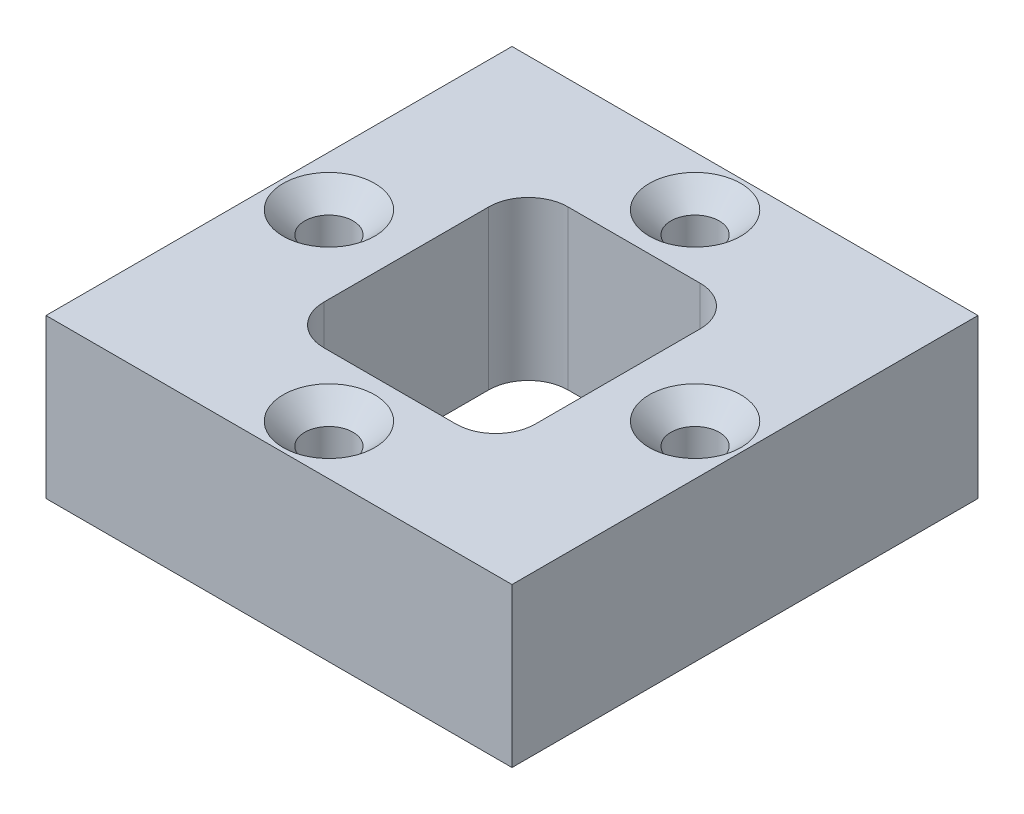
ISO-10303-21;
HEADER;
FILE_DESCRIPTION(('STEP AP214'),'2;1');
FILE_NAME('part.step','',(''),(''),'','','');
FILE_SCHEMA(('AUTOMOTIVE_DESIGN { 1 0 10303 214 1 1 1 1 }'));
ENDSEC;
DATA;
#1=APPLICATION_CONTEXT('core data for automotive mechanical design processes');
#2=APPLICATION_PROTOCOL_DEFINITION('international standard','automotive_design',2000,#1);
#3=PRODUCT_CONTEXT('',#1,'mechanical');
#4=PRODUCT('Part','Part','',(#3));
#5=PRODUCT_RELATED_PRODUCT_CATEGORY('part','',(#4));
#6=PRODUCT_DEFINITION_FORMATION('','',#4);
#7=PRODUCT_DEFINITION_CONTEXT('part definition',#1,'design');
#8=PRODUCT_DEFINITION('design','',#6,#7);
#9=PRODUCT_DEFINITION_SHAPE('','',#8);
#10=(LENGTH_UNIT() NAMED_UNIT(*) SI_UNIT(.MILLI.,.METRE.));
#11=(NAMED_UNIT(*) PLANE_ANGLE_UNIT() SI_UNIT($,.RADIAN.));
#12=(NAMED_UNIT(*) SI_UNIT($,.STERADIAN.) SOLID_ANGLE_UNIT());
#13=UNCERTAINTY_MEASURE_WITH_UNIT(LENGTH_MEASURE(1.E-05),#10,'distance_accuracy_value','');
#14=(GEOMETRIC_REPRESENTATION_CONTEXT(3) GLOBAL_UNCERTAINTY_ASSIGNED_CONTEXT((#13)) GLOBAL_UNIT_ASSIGNED_CONTEXT((#10,
#11,#12)) REPRESENTATION_CONTEXT('',''));
#15=CARTESIAN_POINT('',(0.,0.,0.));
#16=DIRECTION('',(0.,0.,1.));
#17=DIRECTION('',(1.,0.,0.));
#18=AXIS2_PLACEMENT_3D('',#15,#16,#17);
#19=CARTESIAN_POINT('',(-14.,9.525,14.));
#20=DIRECTION('',(1.,0.,0.));
#21=DIRECTION('',(0.,0.,-1.));
#22=AXIS2_PLACEMENT_3D('',#19,#20,#21);
#23=PLANE('',#22);
#24=DIRECTION('',(0.,0.,1.));
#25=VECTOR('',#24,1.);
#26=CARTESIAN_POINT('',(-14.,0.,14.));
#27=LINE('',#26,#25);
#28=CARTESIAN_POINT('',(-14.,0.,-14.));
#29=VERTEX_POINT('',#28);
#30=CARTESIAN_POINT('',(-14.,0.,14.));
#31=VERTEX_POINT('',#30);
#32=EDGE_CURVE('E153',#29,#31,#27,.T.);
#33=ORIENTED_EDGE('',*,*,#32,.T.);
#34=DIRECTION('',(0.,-1.,0.));
#35=VECTOR('',#34,1.);
#36=CARTESIAN_POINT('',(-14.,9.525,14.));
#37=LINE('',#36,#35);
#38=CARTESIAN_POINT('',(-14.,9.525,14.));
#39=VERTEX_POINT('',#38);
#40=EDGE_CURVE('E134',#39,#31,#37,.T.);
#41=ORIENTED_EDGE('',*,*,#40,.F.);
#42=DIRECTION('',(0.,0.,1.));
#43=VECTOR('',#42,1.);
#44=CARTESIAN_POINT('',(-14.,9.525,14.));
#45=LINE('',#44,#43);
#46=CARTESIAN_POINT('',(-14.,9.525,-14.));
#47=VERTEX_POINT('',#46);
#48=EDGE_CURVE('E141',#47,#39,#45,.T.);
#49=ORIENTED_EDGE('',*,*,#48,.F.);
#50=DIRECTION('',(0.,-1.,0.));
#51=VECTOR('',#50,1.);
#52=CARTESIAN_POINT('',(-14.,9.525,-14.));
#53=LINE('',#52,#51);
#54=EDGE_CURVE('E246',#47,#29,#53,.T.);
#55=ORIENTED_EDGE('',*,*,#54,.T.);
#56=EDGE_LOOP('',(#33,#41,#49,#55));
#57=FACE_BOUND('',#56,.T.);
#58=ADVANCED_FACE('F39',(#57),#23,.F.);
#59=CARTESIAN_POINT('',(14.,9.525,14.));
#60=DIRECTION('',(0.,0.,-1.));
#61=DIRECTION('',(-1.,0.,0.));
#62=AXIS2_PLACEMENT_3D('',#59,#60,#61);
#63=PLANE('',#62);
#64=DIRECTION('',(1.,0.,0.));
#65=VECTOR('',#64,1.);
#66=CARTESIAN_POINT('',(14.,0.,14.));
#67=LINE('',#66,#65);
#68=CARTESIAN_POINT('',(14.,0.,14.));
#69=VERTEX_POINT('',#68);
#70=EDGE_CURVE('E248',#31,#69,#67,.T.);
#71=ORIENTED_EDGE('',*,*,#70,.T.);
#72=DIRECTION('',(0.,-1.,0.));
#73=VECTOR('',#72,1.);
#74=CARTESIAN_POINT('',(14.,9.525,14.));
#75=LINE('',#74,#73);
#76=CARTESIAN_POINT('',(14.,9.525,14.));
#77=VERTEX_POINT('',#76);
#78=EDGE_CURVE('E137',#77,#69,#75,.T.);
#79=ORIENTED_EDGE('',*,*,#78,.F.);
#80=DIRECTION('',(1.,0.,0.));
#81=VECTOR('',#80,1.);
#82=CARTESIAN_POINT('',(14.,9.525,14.));
#83=LINE('',#82,#81);
#84=EDGE_CURVE('E130',#39,#77,#83,.T.);
#85=ORIENTED_EDGE('',*,*,#84,.F.);
#86=ORIENTED_EDGE('',*,*,#40,.T.);
#87=EDGE_LOOP('',(#71,#79,#85,#86));
#88=FACE_BOUND('',#87,.T.);
#89=ADVANCED_FACE('F132',(#88),#63,.F.);
#90=CARTESIAN_POINT('',(14.,9.525,14.));
#91=DIRECTION('',(-1.,0.,0.));
#92=DIRECTION('',(0.,0.,1.));
#93=AXIS2_PLACEMENT_3D('',#90,#91,#92);
#94=PLANE('',#93);
#95=DIRECTION('',(0.,0.,-1.));
#96=VECTOR('',#95,1.);
#97=CARTESIAN_POINT('',(14.,0.,14.));
#98=LINE('',#97,#96);
#99=CARTESIAN_POINT('',(14.,0.,-14.));
#100=VERTEX_POINT('',#99);
#101=EDGE_CURVE('E250',#69,#100,#98,.T.);
#102=ORIENTED_EDGE('',*,*,#101,.T.);
#103=DIRECTION('',(0.,-1.,0.));
#104=VECTOR('',#103,1.);
#105=CARTESIAN_POINT('',(14.,9.525,-14.));
#106=LINE('',#105,#104);
#107=CARTESIAN_POINT('',(14.,9.525,-14.));
#108=VERTEX_POINT('',#107);
#109=EDGE_CURVE('E158',#108,#100,#106,.T.);
#110=ORIENTED_EDGE('',*,*,#109,.F.);
#111=DIRECTION('',(0.,0.,-1.));
#112=VECTOR('',#111,1.);
#113=CARTESIAN_POINT('',(14.,9.525,14.));
#114=LINE('',#113,#112);
#115=EDGE_CURVE('E140',#77,#108,#114,.T.);
#116=ORIENTED_EDGE('',*,*,#115,.F.);
#117=ORIENTED_EDGE('',*,*,#78,.T.);
#118=EDGE_LOOP('',(#102,#110,#116,#117));
#119=FACE_BOUND('',#118,.T.);
#120=ADVANCED_FACE('F262',(#119),#94,.F.);
#121=CARTESIAN_POINT('',(14.,9.525,-14.));
#122=DIRECTION('',(0.,0.,1.));
#123=DIRECTION('',(1.,0.,0.));
#124=AXIS2_PLACEMENT_3D('',#121,#122,#123);
#125=PLANE('',#124);
#126=DIRECTION('',(-1.,0.,0.));
#127=VECTOR('',#126,1.);
#128=CARTESIAN_POINT('',(14.,0.,-14.));
#129=LINE('',#128,#127);
#130=EDGE_CURVE('E150',#100,#29,#129,.T.);
#131=ORIENTED_EDGE('',*,*,#130,.T.);
#132=ORIENTED_EDGE('',*,*,#54,.F.);
#133=DIRECTION('',(-1.,0.,0.));
#134=VECTOR('',#133,1.);
#135=CARTESIAN_POINT('',(14.,9.525,-14.));
#136=LINE('',#135,#134);
#137=EDGE_CURVE('E146',#108,#47,#136,.T.);
#138=ORIENTED_EDGE('',*,*,#137,.F.);
#139=ORIENTED_EDGE('',*,*,#109,.T.);
#140=EDGE_LOOP('',(#131,#132,#138,#139));
#141=FACE_BOUND('',#140,.T.);
#142=ADVANCED_FACE('F257',(#141),#125,.F.);
#143=CARTESIAN_POINT('',(0.,9.525,0.));
#144=DIRECTION('',(0.,1.,0.));
#145=DIRECTION('',(0.,0.,1.));
#146=AXIS2_PLACEMENT_3D('',#143,#144,#145);
#147=PLANE('',#146);
#148=CARTESIAN_POINT('',(-11.,9.525,0.));
#149=DIRECTION('',(0.,1.,0.));
#150=DIRECTION('',(0.,0.,1.));
#151=AXIS2_PLACEMENT_3D('',#148,#149,#150);
#152=CIRCLE('',#151,2.75);
#153=CARTESIAN_POINT('',(-11.,9.525,2.75));
#154=VERTEX_POINT('',#153);
#155=EDGE_CURVE('E370',#154,#154,#152,.T.);
#156=ORIENTED_EDGE('',*,*,#155,.F.);
#157=EDGE_LOOP('',(#156));
#158=FACE_BOUND('',#157,.T.);
#159=CARTESIAN_POINT('',(0.,9.525,11.));
#160=DIRECTION('',(0.,1.,0.));
#161=DIRECTION('',(0.,0.,1.));
#162=AXIS2_PLACEMENT_3D('',#159,#160,#161);
#163=CIRCLE('',#162,2.75);
#164=CARTESIAN_POINT('',(0.,9.525,13.75));
#165=VERTEX_POINT('',#164);
#166=EDGE_CURVE('E208',#165,#165,#163,.T.);
#167=ORIENTED_EDGE('',*,*,#166,.F.);
#168=EDGE_LOOP('',(#167));
#169=FACE_BOUND('',#168,.T.);
#170=CARTESIAN_POINT('',(11.,9.525,0.));
#171=DIRECTION('',(0.,1.,0.));
#172=DIRECTION('',(0.,0.,1.));
#173=AXIS2_PLACEMENT_3D('',#170,#171,#172);
#174=CIRCLE('',#173,2.75);
#175=CARTESIAN_POINT('',(11.,9.525,2.75));
#176=VERTEX_POINT('',#175);
#177=EDGE_CURVE('E201',#176,#176,#174,.T.);
#178=ORIENTED_EDGE('',*,*,#177,.F.);
#179=EDGE_LOOP('',(#178));
#180=FACE_BOUND('',#179,.T.);
#181=CARTESIAN_POINT('',(0.,9.525,-11.));
#182=DIRECTION('',(0.,1.,0.));
#183=DIRECTION('',(0.,0.,1.));
#184=AXIS2_PLACEMENT_3D('',#181,#182,#183);
#185=CIRCLE('',#184,2.75);
#186=CARTESIAN_POINT('',(0.,9.525,-8.25));
#187=VERTEX_POINT('',#186);
#188=EDGE_CURVE('E197',#187,#187,#185,.T.);
#189=ORIENTED_EDGE('',*,*,#188,.F.);
#190=EDGE_LOOP('',(#189));
#191=FACE_BOUND('',#190,.T.);
#192=DIRECTION('',(0.,0.,1.));
#193=VECTOR('',#192,1.);
#194=CARTESIAN_POINT('',(-6.35,9.525,7.332345));
#195=LINE('',#194,#193);
#196=CARTESIAN_POINT('',(-6.35,9.525,-4.951095));
#197=VERTEX_POINT('',#196);
#198=CARTESIAN_POINT('',(-6.35,9.525,4.951095));
#199=VERTEX_POINT('',#198);
#200=EDGE_CURVE('E193',#197,#199,#195,.T.);
#201=ORIENTED_EDGE('',*,*,#200,.F.);
#202=CARTESIAN_POINT('',(-3.96875,9.525,-4.951095));
#203=DIRECTION('',(0.,1.,0.));
#204=DIRECTION('',(0.,0.,1.));
#205=AXIS2_PLACEMENT_3D('',#202,#203,#204);
#206=CIRCLE('',#205,2.38125);
#207=CARTESIAN_POINT('',(-3.96875,9.525,-7.332345));
#208=VERTEX_POINT('',#207);
#209=EDGE_CURVE('E178',#197,#208,#206,.F.);
#210=ORIENTED_EDGE('',*,*,#209,.T.);
#211=DIRECTION('',(-1.,0.,0.));
#212=VECTOR('',#211,1.);
#213=CARTESIAN_POINT('',(6.35,9.525,-7.332345));
#214=LINE('',#213,#212);
#215=CARTESIAN_POINT('',(3.96875,9.525,-7.332345));
#216=VERTEX_POINT('',#215);
#217=EDGE_CURVE('E226',#216,#208,#214,.T.);
#218=ORIENTED_EDGE('',*,*,#217,.F.);
#219=CARTESIAN_POINT('',(3.96875,9.525,-4.951095));
#220=DIRECTION('',(0.,1.,0.));
#221=DIRECTION('',(0.,0.,1.));
#222=AXIS2_PLACEMENT_3D('',#219,#220,#221);
#223=CIRCLE('',#222,2.38125);
#224=CARTESIAN_POINT('',(6.35,9.525,-4.951095));
#225=VERTEX_POINT('',#224);
#226=EDGE_CURVE('E182',#216,#225,#223,.F.);
#227=ORIENTED_EDGE('',*,*,#226,.T.);
#228=DIRECTION('',(0.,0.,-1.));
#229=VECTOR('',#228,1.);
#230=CARTESIAN_POINT('',(6.35,9.525,7.332345));
#231=LINE('',#230,#229);
#232=CARTESIAN_POINT('',(6.35,9.525,4.951095));
#233=VERTEX_POINT('',#232);
#234=EDGE_CURVE('E237',#233,#225,#231,.T.);
#235=ORIENTED_EDGE('',*,*,#234,.F.);
#236=CARTESIAN_POINT('',(3.96875,9.525,4.951095));
#237=DIRECTION('',(0.,1.,0.));
#238=DIRECTION('',(0.,0.,1.));
#239=AXIS2_PLACEMENT_3D('',#236,#237,#238);
#240=CIRCLE('',#239,2.38125);
#241=CARTESIAN_POINT('',(3.96875,9.525,7.332345));
#242=VERTEX_POINT('',#241);
#243=EDGE_CURVE('E56',#233,#242,#240,.F.);
#244=ORIENTED_EDGE('',*,*,#243,.T.);
#245=DIRECTION('',(1.,0.,0.));
#246=VECTOR('',#245,1.);
#247=CARTESIAN_POINT('',(6.35,9.525,7.332345));
#248=LINE('',#247,#246);
#249=CARTESIAN_POINT('',(-3.96875,9.525,7.332345));
#250=VERTEX_POINT('',#249);
#251=EDGE_CURVE('E235',#250,#242,#248,.T.);
#252=ORIENTED_EDGE('',*,*,#251,.F.);
#253=CARTESIAN_POINT('',(-3.96875,9.525,4.951095));
#254=DIRECTION('',(0.,1.,0.));
#255=DIRECTION('',(0.,0.,1.));
#256=AXIS2_PLACEMENT_3D('',#253,#254,#255);
#257=CIRCLE('',#256,2.38125);
#258=EDGE_CURVE('E48',#250,#199,#257,.F.);
#259=ORIENTED_EDGE('',*,*,#258,.T.);
#260=EDGE_LOOP('',(#201,#210,#218,#227,#235,#244,#252,#259));
#261=FACE_BOUND('',#260,.T.);
#262=ORIENTED_EDGE('',*,*,#48,.T.);
#263=ORIENTED_EDGE('',*,*,#84,.T.);
#264=ORIENTED_EDGE('',*,*,#115,.T.);
#265=ORIENTED_EDGE('',*,*,#137,.T.);
#266=EDGE_LOOP('',(#262,#263,#264,#265));
#267=FACE_BOUND('',#266,.T.);
#268=ADVANCED_FACE('F144',(#158,#169,#180,#191,#261,#267),#147,.T.);
#269=CARTESIAN_POINT('',(0.,0.,0.));
#270=DIRECTION('',(0.,1.,0.));
#271=DIRECTION('',(0.,0.,1.));
#272=AXIS2_PLACEMENT_3D('',#269,#270,#271);
#273=PLANE('',#272);
#274=CARTESIAN_POINT('',(-11.,0.,0.));
#275=DIRECTION('',(0.,1.,0.));
#276=DIRECTION('',(0.,0.,1.));
#277=AXIS2_PLACEMENT_3D('',#274,#275,#276);
#278=CIRCLE('',#277,1.44999999999999);
#279=CARTESIAN_POINT('',(-11.,0.,1.44999999999999));
#280=VERTEX_POINT('',#279);
#281=EDGE_CURVE('E43',#280,#280,#278,.T.);
#282=ORIENTED_EDGE('',*,*,#281,.T.);
#283=EDGE_LOOP('',(#282));
#284=FACE_BOUND('',#283,.T.);
#285=CARTESIAN_POINT('',(0.,0.,11.));
#286=DIRECTION('',(0.,1.,0.));
#287=DIRECTION('',(0.,0.,1.));
#288=AXIS2_PLACEMENT_3D('',#285,#286,#287);
#289=CIRCLE('',#288,1.44999999999999);
#290=CARTESIAN_POINT('',(0.,0.,12.45));
#291=VERTEX_POINT('',#290);
#292=EDGE_CURVE('E199',#291,#291,#289,.T.);
#293=ORIENTED_EDGE('',*,*,#292,.T.);
#294=EDGE_LOOP('',(#293));
#295=FACE_BOUND('',#294,.T.);
#296=CARTESIAN_POINT('',(11.,0.,0.));
#297=DIRECTION('',(0.,1.,0.));
#298=DIRECTION('',(0.,0.,1.));
#299=AXIS2_PLACEMENT_3D('',#296,#297,#298);
#300=CIRCLE('',#299,1.44999999999999);
#301=CARTESIAN_POINT('',(11.,0.,1.44999999999999));
#302=VERTEX_POINT('',#301);
#303=EDGE_CURVE('E195',#302,#302,#300,.T.);
#304=ORIENTED_EDGE('',*,*,#303,.T.);
#305=EDGE_LOOP('',(#304));
#306=FACE_BOUND('',#305,.T.);
#307=CARTESIAN_POINT('',(0.,0.,-11.));
#308=DIRECTION('',(0.,1.,0.));
#309=DIRECTION('',(0.,0.,1.));
#310=AXIS2_PLACEMENT_3D('',#307,#308,#309);
#311=CIRCLE('',#310,1.44999999999999);
#312=CARTESIAN_POINT('',(0.,0.,-9.55000000000001));
#313=VERTEX_POINT('',#312);
#314=EDGE_CURVE('E190',#313,#313,#311,.T.);
#315=ORIENTED_EDGE('',*,*,#314,.T.);
#316=EDGE_LOOP('',(#315));
#317=FACE_BOUND('',#316,.T.);
#318=DIRECTION('',(1.,0.,0.));
#319=VECTOR('',#318,1.);
#320=CARTESIAN_POINT('',(6.35,0.,-7.332345));
#321=LINE('',#320,#319);
#322=CARTESIAN_POINT('',(-3.96875,0.,-7.332345));
#323=VERTEX_POINT('',#322);
#324=CARTESIAN_POINT('',(3.96875,0.,-7.332345));
#325=VERTEX_POINT('',#324);
#326=EDGE_CURVE('E225',#323,#325,#321,.T.);
#327=ORIENTED_EDGE('',*,*,#326,.F.);
#328=CARTESIAN_POINT('',(-3.96875,0.,-4.951095));
#329=DIRECTION('',(0.,1.,0.));
#330=DIRECTION('',(0.,0.,1.));
#331=AXIS2_PLACEMENT_3D('',#328,#329,#330);
#332=CIRCLE('',#331,2.38125);
#333=CARTESIAN_POINT('',(-6.35,0.,-4.951095));
#334=VERTEX_POINT('',#333);
#335=EDGE_CURVE('E180',#323,#334,#332,.T.);
#336=ORIENTED_EDGE('',*,*,#335,.T.);
#337=DIRECTION('',(0.,0.,-1.));
#338=VECTOR('',#337,1.);
#339=CARTESIAN_POINT('',(-6.35,0.,7.332345));
#340=LINE('',#339,#338);
#341=CARTESIAN_POINT('',(-6.35,0.,4.951095));
#342=VERTEX_POINT('',#341);
#343=EDGE_CURVE('E229',#342,#334,#340,.T.);
#344=ORIENTED_EDGE('',*,*,#343,.F.);
#345=CARTESIAN_POINT('',(-3.96875,0.,4.951095));
#346=DIRECTION('',(0.,1.,0.));
#347=DIRECTION('',(0.,0.,1.));
#348=AXIS2_PLACEMENT_3D('',#345,#346,#347);
#349=CIRCLE('',#348,2.38125);
#350=CARTESIAN_POINT('',(-3.96875,0.,7.332345));
#351=VERTEX_POINT('',#350);
#352=EDGE_CURVE('E11',#342,#351,#349,.T.);
#353=ORIENTED_EDGE('',*,*,#352,.T.);
#354=DIRECTION('',(-1.,0.,0.));
#355=VECTOR('',#354,1.);
#356=CARTESIAN_POINT('',(6.35,0.,7.332345));
#357=LINE('',#356,#355);
#358=CARTESIAN_POINT('',(3.96875,0.,7.332345));
#359=VERTEX_POINT('',#358);
#360=EDGE_CURVE('E232',#359,#351,#357,.T.);
#361=ORIENTED_EDGE('',*,*,#360,.F.);
#362=CARTESIAN_POINT('',(3.96875,0.,4.951095));
#363=DIRECTION('',(0.,1.,0.));
#364=DIRECTION('',(0.,0.,1.));
#365=AXIS2_PLACEMENT_3D('',#362,#363,#364);
#366=CIRCLE('',#365,2.38125);
#367=CARTESIAN_POINT('',(6.35,0.,4.951095));
#368=VERTEX_POINT('',#367);
#369=EDGE_CURVE('E187',#359,#368,#366,.T.);
#370=ORIENTED_EDGE('',*,*,#369,.T.);
#371=DIRECTION('',(0.,0.,1.));
#372=VECTOR('',#371,1.);
#373=CARTESIAN_POINT('',(6.35,0.,7.332345));
#374=LINE('',#373,#372);
#375=CARTESIAN_POINT('',(6.35,0.,-4.951095));
#376=VERTEX_POINT('',#375);
#377=EDGE_CURVE('E222',#376,#368,#374,.T.);
#378=ORIENTED_EDGE('',*,*,#377,.F.);
#379=CARTESIAN_POINT('',(3.96875,0.,-4.951095));
#380=DIRECTION('',(0.,1.,0.));
#381=DIRECTION('',(0.,0.,1.));
#382=AXIS2_PLACEMENT_3D('',#379,#380,#381);
#383=CIRCLE('',#382,2.38125);
#384=EDGE_CURVE('E184',#376,#325,#383,.T.);
#385=ORIENTED_EDGE('',*,*,#384,.T.);
#386=EDGE_LOOP('',(#327,#336,#344,#353,#361,#370,#378,#385));
#387=FACE_BOUND('',#386,.T.);
#388=ORIENTED_EDGE('',*,*,#32,.F.);
#389=ORIENTED_EDGE('',*,*,#130,.F.);
#390=ORIENTED_EDGE('',*,*,#101,.F.);
#391=ORIENTED_EDGE('',*,*,#70,.F.);
#392=EDGE_LOOP('',(#388,#389,#390,#391));
#393=FACE_BOUND('',#392,.T.);
#394=ADVANCED_FACE('F261',(#284,#295,#306,#317,#387,#393),#273,.F.);
#395=CARTESIAN_POINT('',(-6.35,-19.3995652733792,7.332345));
#396=DIRECTION('',(-1.,0.,0.));
#397=DIRECTION('',(0.,0.,1.));
#398=AXIS2_PLACEMENT_3D('',#395,#396,#397);
#399=PLANE('',#398);
#400=ORIENTED_EDGE('',*,*,#343,.T.);
#401=DIRECTION('',(0.,1.,0.));
#402=VECTOR('',#401,1.);
#403=CARTESIAN_POINT('',(-6.35,9.525,-4.951095));
#404=LINE('',#403,#402);
#405=EDGE_CURVE('E156',#334,#197,#404,.T.);
#406=ORIENTED_EDGE('',*,*,#405,.T.);
#407=ORIENTED_EDGE('',*,*,#200,.T.);
#408=DIRECTION('',(0.,1.,0.));
#409=VECTOR('',#408,1.);
#410=CARTESIAN_POINT('',(-6.35,0.,4.951095));
#411=LINE('',#410,#409);
#412=EDGE_CURVE('E154',#199,#342,#411,.F.);
#413=ORIENTED_EDGE('',*,*,#412,.T.);
#414=EDGE_LOOP('',(#400,#406,#407,#413));
#415=FACE_BOUND('',#414,.T.);
#416=ADVANCED_FACE('F312',(#415),#399,.F.);
#417=CARTESIAN_POINT('',(6.35,-19.3995652733792,-7.332345));
#418=DIRECTION('',(0.,0.,-1.));
#419=DIRECTION('',(-1.,0.,0.));
#420=AXIS2_PLACEMENT_3D('',#417,#418,#419);
#421=PLANE('',#420);
#422=ORIENTED_EDGE('',*,*,#217,.T.);
#423=DIRECTION('',(0.,1.,0.));
#424=VECTOR('',#423,1.);
#425=CARTESIAN_POINT('',(-3.96875,0.,-7.332345));
#426=LINE('',#425,#424);
#427=EDGE_CURVE('E167',#208,#323,#426,.F.);
#428=ORIENTED_EDGE('',*,*,#427,.T.);
#429=ORIENTED_EDGE('',*,*,#326,.T.);
#430=DIRECTION('',(0.,1.,0.));
#431=VECTOR('',#430,1.);
#432=CARTESIAN_POINT('',(3.96875,9.525,-7.332345));
#433=LINE('',#432,#431);
#434=EDGE_CURVE('E164',#325,#216,#433,.T.);
#435=ORIENTED_EDGE('',*,*,#434,.T.);
#436=EDGE_LOOP('',(#422,#428,#429,#435));
#437=FACE_BOUND('',#436,.T.);
#438=ADVANCED_FACE('F305',(#437),#421,.F.);
#439=CARTESIAN_POINT('',(6.35,-19.3995652733792,7.332345));
#440=DIRECTION('',(1.,0.,0.));
#441=DIRECTION('',(0.,0.,-1.));
#442=AXIS2_PLACEMENT_3D('',#439,#440,#441);
#443=PLANE('',#442);
#444=ORIENTED_EDGE('',*,*,#234,.T.);
#445=DIRECTION('',(0.,1.,0.));
#446=VECTOR('',#445,1.);
#447=CARTESIAN_POINT('',(6.35,0.,-4.951095));
#448=LINE('',#447,#446);
#449=EDGE_CURVE('E172',#225,#376,#448,.F.);
#450=ORIENTED_EDGE('',*,*,#449,.T.);
#451=ORIENTED_EDGE('',*,*,#377,.T.);
#452=DIRECTION('',(0.,1.,0.));
#453=VECTOR('',#452,1.);
#454=CARTESIAN_POINT('',(6.35,9.525,4.951095));
#455=LINE('',#454,#453);
#456=EDGE_CURVE('E169',#368,#233,#455,.T.);
#457=ORIENTED_EDGE('',*,*,#456,.T.);
#458=EDGE_LOOP('',(#444,#450,#451,#457));
#459=FACE_BOUND('',#458,.T.);
#460=ADVANCED_FACE('F300',(#459),#443,.F.);
#461=CARTESIAN_POINT('',(6.35,-19.3995652733792,7.332345));
#462=DIRECTION('',(0.,0.,1.));
#463=DIRECTION('',(1.,0.,0.));
#464=AXIS2_PLACEMENT_3D('',#461,#462,#463);
#465=PLANE('',#464);
#466=ORIENTED_EDGE('',*,*,#251,.T.);
#467=DIRECTION('',(0.,1.,0.));
#468=VECTOR('',#467,1.);
#469=CARTESIAN_POINT('',(3.96875,0.,7.332345));
#470=LINE('',#469,#468);
#471=EDGE_CURVE('E176',#242,#359,#470,.F.);
#472=ORIENTED_EDGE('',*,*,#471,.T.);
#473=ORIENTED_EDGE('',*,*,#360,.T.);
#474=DIRECTION('',(0.,1.,0.));
#475=VECTOR('',#474,1.);
#476=CARTESIAN_POINT('',(-3.96875,9.525,7.332345));
#477=LINE('',#476,#475);
#478=EDGE_CURVE('E174',#351,#250,#477,.T.);
#479=ORIENTED_EDGE('',*,*,#478,.T.);
#480=EDGE_LOOP('',(#466,#472,#473,#479));
#481=FACE_BOUND('',#480,.T.);
#482=ADVANCED_FACE('F280',(#481),#465,.F.);
#483=CARTESIAN_POINT('',(-3.96875,-19.3995652733792,-4.951095));
#484=DIRECTION('',(0.,-1.,0.));
#485=DIRECTION('',(0.,0.,-1.));
#486=AXIS2_PLACEMENT_3D('',#483,#484,#485);
#487=CYLINDRICAL_SURFACE('',#486,2.38125);
#488=ORIENTED_EDGE('',*,*,#335,.F.);
#489=ORIENTED_EDGE('',*,*,#427,.F.);
#490=ORIENTED_EDGE('',*,*,#209,.F.);
#491=ORIENTED_EDGE('',*,*,#405,.F.);
#492=EDGE_LOOP('',(#488,#489,#490,#491));
#493=FACE_BOUND('',#492,.T.);
#494=ADVANCED_FACE('F276',(#493),#487,.F.);
#495=CARTESIAN_POINT('',(3.96875,-19.3995652733792,-4.951095));
#496=DIRECTION('',(0.,-1.,0.));
#497=DIRECTION('',(0.,0.,-1.));
#498=AXIS2_PLACEMENT_3D('',#495,#496,#497);
#499=CYLINDRICAL_SURFACE('',#498,2.38125);
#500=ORIENTED_EDGE('',*,*,#384,.F.);
#501=ORIENTED_EDGE('',*,*,#449,.F.);
#502=ORIENTED_EDGE('',*,*,#226,.F.);
#503=ORIENTED_EDGE('',*,*,#434,.F.);
#504=EDGE_LOOP('',(#500,#501,#502,#503));
#505=FACE_BOUND('',#504,.T.);
#506=ADVANCED_FACE('F279',(#505),#499,.F.);
#507=CARTESIAN_POINT('',(3.96875,-19.3995652733792,4.951095));
#508=DIRECTION('',(0.,-1.,0.));
#509=DIRECTION('',(0.,0.,-1.));
#510=AXIS2_PLACEMENT_3D('',#507,#508,#509);
#511=CYLINDRICAL_SURFACE('',#510,2.38125);
#512=ORIENTED_EDGE('',*,*,#369,.F.);
#513=ORIENTED_EDGE('',*,*,#471,.F.);
#514=ORIENTED_EDGE('',*,*,#243,.F.);
#515=ORIENTED_EDGE('',*,*,#456,.F.);
#516=EDGE_LOOP('',(#512,#513,#514,#515));
#517=FACE_BOUND('',#516,.T.);
#518=ADVANCED_FACE('F283',(#517),#511,.F.);
#519=CARTESIAN_POINT('',(-3.96875,-19.3995652733792,4.951095));
#520=DIRECTION('',(0.,-1.,0.));
#521=DIRECTION('',(0.,0.,-1.));
#522=AXIS2_PLACEMENT_3D('',#519,#520,#521);
#523=CYLINDRICAL_SURFACE('',#522,2.38125);
#524=ORIENTED_EDGE('',*,*,#352,.F.);
#525=ORIENTED_EDGE('',*,*,#412,.F.);
#526=ORIENTED_EDGE('',*,*,#258,.F.);
#527=ORIENTED_EDGE('',*,*,#478,.F.);
#528=EDGE_LOOP('',(#524,#525,#526,#527));
#529=FACE_BOUND('',#528,.T.);
#530=ADVANCED_FACE('F41',(#529),#523,.F.);
#531=CARTESIAN_POINT('',(0.,9.525,-11.));
#532=DIRECTION('',(0.,1.,0.));
#533=DIRECTION('',(0.,0.,1.));
#534=AXIS2_PLACEMENT_3D('',#531,#532,#533);
#535=CYLINDRICAL_SURFACE('',#534,1.44999999999999);
#536=CARTESIAN_POINT('',(0.,8.225,-11.));
#537=DIRECTION('',(0.,1.,0.));
#538=DIRECTION('',(0.,0.,1.));
#539=AXIS2_PLACEMENT_3D('',#536,#537,#538);
#540=CIRCLE('',#539,1.45);
#541=CARTESIAN_POINT('',(0.,8.225,-9.55));
#542=VERTEX_POINT('',#541);
#543=EDGE_CURVE('E194',#542,#542,#540,.T.);
#544=ORIENTED_EDGE('',*,*,#543,.T.);
#545=EDGE_LOOP('',(#544));
#546=FACE_BOUND('',#545,.T.);
#547=ORIENTED_EDGE('',*,*,#314,.F.);
#548=EDGE_LOOP('',(#547));
#549=FACE_BOUND('',#548,.T.);
#550=ADVANCED_FACE('F290',(#546,#549),#535,.F.);
#551=CARTESIAN_POINT('',(0.,9.525,-11.));
#552=DIRECTION('',(0.,1.,0.));
#553=DIRECTION('',(0.,0.,1.));
#554=AXIS2_PLACEMENT_3D('',#551,#552,#553);
#555=CONICAL_SURFACE('',#554,2.75,0.785398163397448);
#556=ORIENTED_EDGE('',*,*,#543,.F.);
#557=EDGE_LOOP('',(#556));
#558=FACE_BOUND('',#557,.T.);
#559=ORIENTED_EDGE('',*,*,#188,.T.);
#560=EDGE_LOOP('',(#559));
#561=FACE_BOUND('',#560,.T.);
#562=ADVANCED_FACE('F336',(#558,#561),#555,.F.);
#563=CARTESIAN_POINT('',(11.,9.525,0.));
#564=DIRECTION('',(0.,1.,0.));
#565=DIRECTION('',(0.,0.,1.));
#566=AXIS2_PLACEMENT_3D('',#563,#564,#565);
#567=CYLINDRICAL_SURFACE('',#566,1.44999999999999);
#568=CARTESIAN_POINT('',(11.,8.225,0.));
#569=DIRECTION('',(0.,1.,0.));
#570=DIRECTION('',(0.,0.,1.));
#571=AXIS2_PLACEMENT_3D('',#568,#569,#570);
#572=CIRCLE('',#571,1.45);
#573=CARTESIAN_POINT('',(11.,8.225,1.45));
#574=VERTEX_POINT('',#573);
#575=EDGE_CURVE('E198',#574,#574,#572,.T.);
#576=ORIENTED_EDGE('',*,*,#575,.T.);
#577=EDGE_LOOP('',(#576));
#578=FACE_BOUND('',#577,.T.);
#579=ORIENTED_EDGE('',*,*,#303,.F.);
#580=EDGE_LOOP('',(#579));
#581=FACE_BOUND('',#580,.T.);
#582=ADVANCED_FACE('F340',(#578,#581),#567,.F.);
#583=CARTESIAN_POINT('',(11.,9.525,0.));
#584=DIRECTION('',(0.,1.,0.));
#585=DIRECTION('',(0.,0.,1.));
#586=AXIS2_PLACEMENT_3D('',#583,#584,#585);
#587=CONICAL_SURFACE('',#586,2.75,0.785398163397448);
#588=ORIENTED_EDGE('',*,*,#575,.F.);
#589=EDGE_LOOP('',(#588));
#590=FACE_BOUND('',#589,.T.);
#591=ORIENTED_EDGE('',*,*,#177,.T.);
#592=EDGE_LOOP('',(#591));
#593=FACE_BOUND('',#592,.T.);
#594=ADVANCED_FACE('F344',(#590,#593),#587,.F.);
#595=CARTESIAN_POINT('',(0.,9.525,11.));
#596=DIRECTION('',(0.,1.,0.));
#597=DIRECTION('',(0.,0.,1.));
#598=AXIS2_PLACEMENT_3D('',#595,#596,#597);
#599=CYLINDRICAL_SURFACE('',#598,1.44999999999999);
#600=CARTESIAN_POINT('',(0.,8.225,11.));
#601=DIRECTION('',(0.,1.,0.));
#602=DIRECTION('',(0.,0.,1.));
#603=AXIS2_PLACEMENT_3D('',#600,#601,#602);
#604=CIRCLE('',#603,1.45);
#605=CARTESIAN_POINT('',(0.,8.225,12.45));
#606=VERTEX_POINT('',#605);
#607=EDGE_CURVE('E202',#606,#606,#604,.T.);
#608=ORIENTED_EDGE('',*,*,#607,.T.);
#609=EDGE_LOOP('',(#608));
#610=FACE_BOUND('',#609,.T.);
#611=ORIENTED_EDGE('',*,*,#292,.F.);
#612=EDGE_LOOP('',(#611));
#613=FACE_BOUND('',#612,.T.);
#614=ADVANCED_FACE('F348',(#610,#613),#599,.F.);
#615=CARTESIAN_POINT('',(0.,9.525,11.));
#616=DIRECTION('',(0.,1.,0.));
#617=DIRECTION('',(0.,0.,1.));
#618=AXIS2_PLACEMENT_3D('',#615,#616,#617);
#619=CONICAL_SURFACE('',#618,2.75,0.785398163397448);
#620=ORIENTED_EDGE('',*,*,#607,.F.);
#621=EDGE_LOOP('',(#620));
#622=FACE_BOUND('',#621,.T.);
#623=ORIENTED_EDGE('',*,*,#166,.T.);
#624=EDGE_LOOP('',(#623));
#625=FACE_BOUND('',#624,.T.);
#626=ADVANCED_FACE('F352',(#622,#625),#619,.F.);
#627=CARTESIAN_POINT('',(-11.,9.525,0.));
#628=DIRECTION('',(0.,1.,0.));
#629=DIRECTION('',(0.,0.,1.));
#630=AXIS2_PLACEMENT_3D('',#627,#628,#629);
#631=CYLINDRICAL_SURFACE('',#630,1.44999999999999);
#632=CARTESIAN_POINT('',(-11.,8.225,0.));
#633=DIRECTION('',(0.,1.,0.));
#634=DIRECTION('',(0.,0.,1.));
#635=AXIS2_PLACEMENT_3D('',#632,#633,#634);
#636=CIRCLE('',#635,1.45);
#637=CARTESIAN_POINT('',(-11.,8.225,1.45));
#638=VERTEX_POINT('',#637);
#639=EDGE_CURVE('E368',#638,#638,#636,.T.);
#640=ORIENTED_EDGE('',*,*,#639,.T.);
#641=EDGE_LOOP('',(#640));
#642=FACE_BOUND('',#641,.T.);
#643=ORIENTED_EDGE('',*,*,#281,.F.);
#644=EDGE_LOOP('',(#643));
#645=FACE_BOUND('',#644,.T.);
#646=ADVANCED_FACE('F355',(#642,#645),#631,.F.);
#647=CARTESIAN_POINT('',(-11.,9.525,0.));
#648=DIRECTION('',(0.,1.,0.));
#649=DIRECTION('',(0.,0.,1.));
#650=AXIS2_PLACEMENT_3D('',#647,#648,#649);
#651=CONICAL_SURFACE('',#650,2.75,0.785398163397448);
#652=ORIENTED_EDGE('',*,*,#639,.F.);
#653=EDGE_LOOP('',(#652));
#654=FACE_BOUND('',#653,.T.);
#655=ORIENTED_EDGE('',*,*,#155,.T.);
#656=EDGE_LOOP('',(#655));
#657=FACE_BOUND('',#656,.T.);
#658=ADVANCED_FACE('F359',(#654,#657),#651,.F.);
#659=CLOSED_SHELL('',(#58,#89,#120,#142,#268,#394,#416,#438,#460,#482,#494,#506,#518,#530,#550,
#562,#582,#594,#614,#626,#646,#658));
#660=MANIFOLD_SOLID_BREP('B2',#659);
#661=ADVANCED_BREP_SHAPE_REPRESENTATION('',(#18,#660),#14);
#662=SHAPE_DEFINITION_REPRESENTATION(#9,#661);
ENDSEC;
END-ISO-10303-21;
